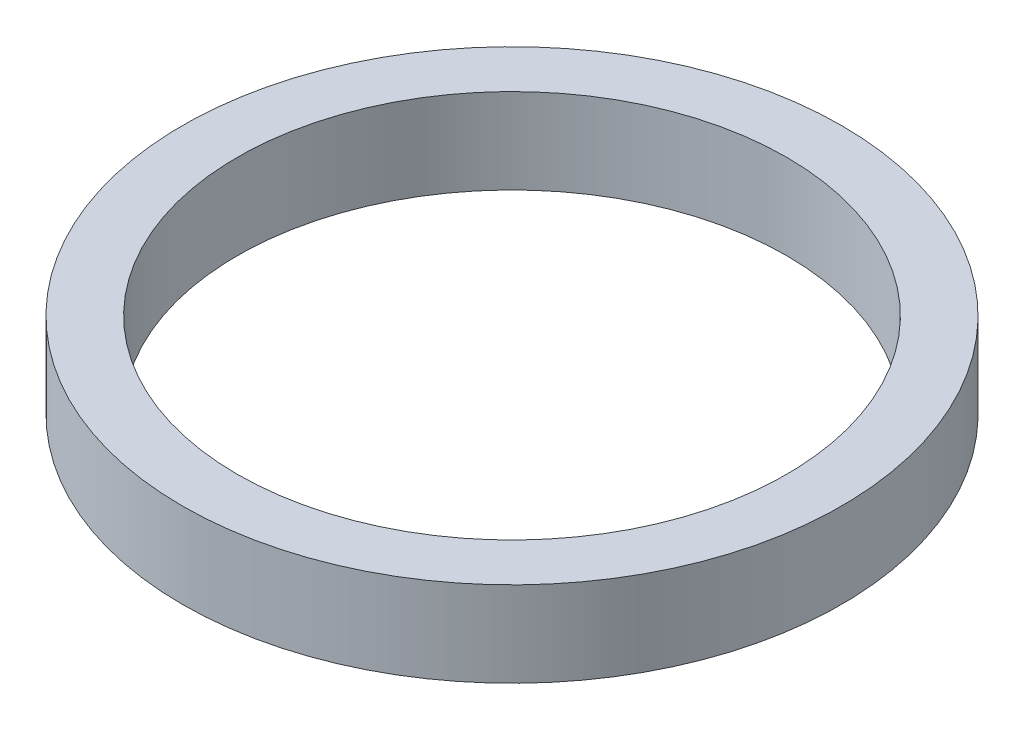
ISO-10303-21;
HEADER;
FILE_DESCRIPTION(('STEP AP214'),'2;1');
FILE_NAME('part.step','',(''),(''),'','','');
FILE_SCHEMA(('AUTOMOTIVE_DESIGN { 1 0 10303 214 1 1 1 1 }'));
ENDSEC;
DATA;
#1=APPLICATION_CONTEXT('core data for automotive mechanical design processes');
#2=APPLICATION_PROTOCOL_DEFINITION('international standard','automotive_design',2000,#1);
#3=PRODUCT_CONTEXT('',#1,'mechanical');
#4=PRODUCT('Part','Part','',(#3));
#5=PRODUCT_RELATED_PRODUCT_CATEGORY('part','',(#4));
#6=PRODUCT_DEFINITION_FORMATION('','',#4);
#7=PRODUCT_DEFINITION_CONTEXT('part definition',#1,'design');
#8=PRODUCT_DEFINITION('design','',#6,#7);
#9=PRODUCT_DEFINITION_SHAPE('','',#8);
#10=(LENGTH_UNIT() NAMED_UNIT(*) SI_UNIT(.MILLI.,.METRE.));
#11=(NAMED_UNIT(*) PLANE_ANGLE_UNIT() SI_UNIT($,.RADIAN.));
#12=(NAMED_UNIT(*) SI_UNIT($,.STERADIAN.) SOLID_ANGLE_UNIT());
#13=UNCERTAINTY_MEASURE_WITH_UNIT(LENGTH_MEASURE(1.E-05),#10,'distance_accuracy_value','');
#14=(GEOMETRIC_REPRESENTATION_CONTEXT(3) GLOBAL_UNCERTAINTY_ASSIGNED_CONTEXT((#13)) GLOBAL_UNIT_ASSIGNED_CONTEXT((#10,
#11,#12)) REPRESENTATION_CONTEXT('',''));
#15=CARTESIAN_POINT('',(0.,0.,0.));
#16=DIRECTION('',(0.,0.,1.));
#17=DIRECTION('',(1.,0.,0.));
#18=AXIS2_PLACEMENT_3D('',#15,#16,#17);
#19=CARTESIAN_POINT('',(0.,2.4638,0.));
#20=DIRECTION('',(0.,1.,0.));
#21=DIRECTION('',(0.,0.,1.));
#22=AXIS2_PLACEMENT_3D('',#19,#20,#21);
#23=PLANE('',#22);
#24=CARTESIAN_POINT('',(0.,2.4638,0.));
#25=DIRECTION('',(0.,1.,0.));
#26=DIRECTION('',(0.,0.,1.));
#27=AXIS2_PLACEMENT_3D('',#24,#25,#26);
#28=CIRCLE('',#27,9.525);
#29=CARTESIAN_POINT('',(0.,2.4638,9.525));
#30=VERTEX_POINT('',#29);
#31=EDGE_CURVE('E10',#30,#30,#28,.T.);
#32=ORIENTED_EDGE('',*,*,#31,.T.);
#33=EDGE_LOOP('',(#32));
#34=FACE_BOUND('',#33,.T.);
#35=CARTESIAN_POINT('',(0.,2.4638,0.));
#36=DIRECTION('',(0.,1.,0.));
#37=DIRECTION('',(0.,0.,1.));
#38=AXIS2_PLACEMENT_3D('',#35,#36,#37);
#39=CIRCLE('',#38,7.9375);
#40=CARTESIAN_POINT('',(0.,2.4638,7.9375));
#41=VERTEX_POINT('',#40);
#42=EDGE_CURVE('E39',#41,#41,#39,.T.);
#43=ORIENTED_EDGE('',*,*,#42,.F.);
#44=EDGE_LOOP('',(#43));
#45=FACE_BOUND('',#44,.T.);
#46=ADVANCED_FACE('F28',(#34,#45),#23,.T.);
#47=CARTESIAN_POINT('',(0.,0.,0.));
#48=DIRECTION('',(0.,1.,0.));
#49=DIRECTION('',(0.,0.,1.));
#50=AXIS2_PLACEMENT_3D('',#47,#48,#49);
#51=PLANE('',#50);
#52=CARTESIAN_POINT('',(0.,0.,0.));
#53=DIRECTION('',(0.,1.,0.));
#54=DIRECTION('',(0.,0.,1.));
#55=AXIS2_PLACEMENT_3D('',#52,#53,#54);
#56=CIRCLE('',#55,9.525);
#57=CARTESIAN_POINT('',(0.,0.,9.525));
#58=VERTEX_POINT('',#57);
#59=EDGE_CURVE('E32',#58,#58,#56,.T.);
#60=ORIENTED_EDGE('',*,*,#59,.F.);
#61=EDGE_LOOP('',(#60));
#62=FACE_BOUND('',#61,.T.);
#63=CARTESIAN_POINT('',(0.,0.,0.));
#64=DIRECTION('',(0.,1.,0.));
#65=DIRECTION('',(0.,0.,1.));
#66=AXIS2_PLACEMENT_3D('',#63,#64,#65);
#67=CIRCLE('',#66,7.9375);
#68=CARTESIAN_POINT('',(0.,0.,7.9375));
#69=VERTEX_POINT('',#68);
#70=EDGE_CURVE('E41',#69,#69,#67,.T.);
#71=ORIENTED_EDGE('',*,*,#70,.T.);
#72=EDGE_LOOP('',(#71));
#73=FACE_BOUND('',#72,.T.);
#74=ADVANCED_FACE('F51',(#62,#73),#51,.F.);
#75=CARTESIAN_POINT('',(0.,2.4638,0.));
#76=DIRECTION('',(0.,-1.,0.));
#77=DIRECTION('',(0.,0.,-1.));
#78=AXIS2_PLACEMENT_3D('',#75,#76,#77);
#79=CYLINDRICAL_SURFACE('',#78,9.525);
#80=ORIENTED_EDGE('',*,*,#31,.F.);
#81=EDGE_LOOP('',(#80));
#82=FACE_BOUND('',#81,.T.);
#83=ORIENTED_EDGE('',*,*,#59,.T.);
#84=EDGE_LOOP('',(#83));
#85=FACE_BOUND('',#84,.T.);
#86=ADVANCED_FACE('F30',(#82,#85),#79,.T.);
#87=CARTESIAN_POINT('',(0.,2.4638,0.));
#88=DIRECTION('',(0.,-1.,0.));
#89=DIRECTION('',(0.,0.,-1.));
#90=AXIS2_PLACEMENT_3D('',#87,#88,#89);
#91=CYLINDRICAL_SURFACE('',#90,7.9375);
#92=ORIENTED_EDGE('',*,*,#42,.T.);
#93=EDGE_LOOP('',(#92));
#94=FACE_BOUND('',#93,.T.);
#95=ORIENTED_EDGE('',*,*,#70,.F.);
#96=EDGE_LOOP('',(#95));
#97=FACE_BOUND('',#96,.T.);
#98=ADVANCED_FACE('F47',(#94,#97),#91,.F.);
#99=CLOSED_SHELL('',(#46,#74,#86,#98));
#100=MANIFOLD_SOLID_BREP('B2',#99);
#101=ADVANCED_BREP_SHAPE_REPRESENTATION('',(#18,#100),#14);
#102=SHAPE_DEFINITION_REPRESENTATION(#9,#101);
ENDSEC;
END-ISO-10303-21;
